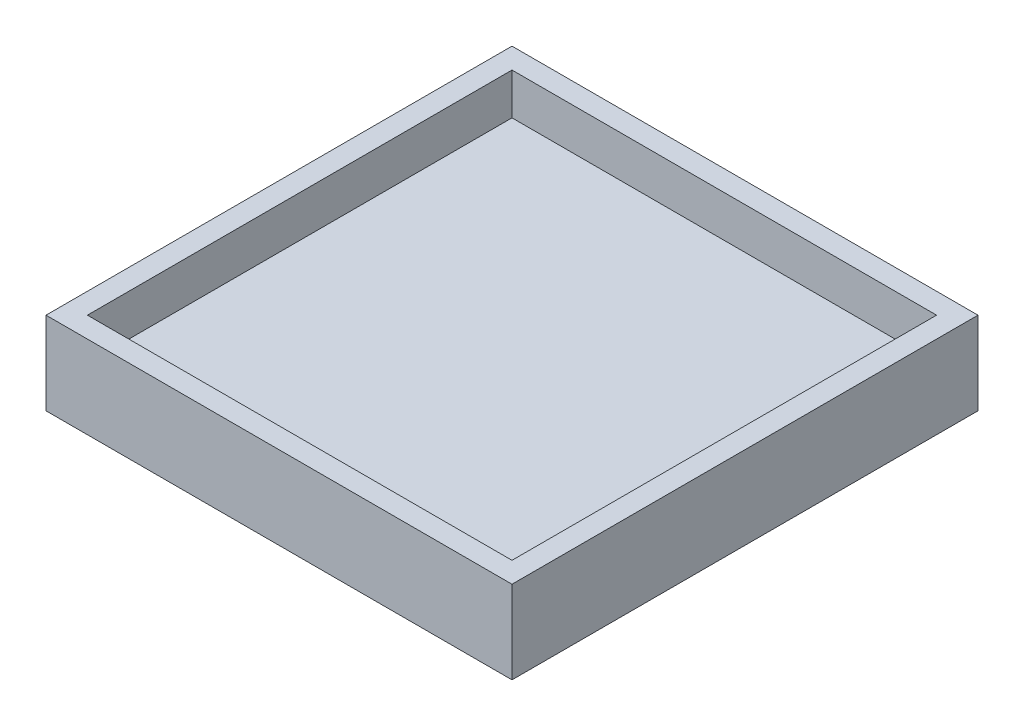
ISO-10303-21;
HEADER;
FILE_DESCRIPTION(('STEP AP214'),'2;1');
FILE_NAME('part.step','',(''),(''),'','','');
FILE_SCHEMA(('AUTOMOTIVE_DESIGN { 1 0 10303 214 1 1 1 1 }'));
ENDSEC;
DATA;
#1=APPLICATION_CONTEXT('core data for automotive mechanical design processes');
#2=APPLICATION_PROTOCOL_DEFINITION('international standard','automotive_design',2000,#1);
#3=PRODUCT_CONTEXT('',#1,'mechanical');
#4=PRODUCT('Part','Part','',(#3));
#5=PRODUCT_RELATED_PRODUCT_CATEGORY('part','',(#4));
#6=PRODUCT_DEFINITION_FORMATION('','',#4);
#7=PRODUCT_DEFINITION_CONTEXT('part definition',#1,'design');
#8=PRODUCT_DEFINITION('design','',#6,#7);
#9=PRODUCT_DEFINITION_SHAPE('','',#8);
#10=(LENGTH_UNIT() NAMED_UNIT(*) SI_UNIT(.MILLI.,.METRE.));
#11=(NAMED_UNIT(*) PLANE_ANGLE_UNIT() SI_UNIT($,.RADIAN.));
#12=(NAMED_UNIT(*) SI_UNIT($,.STERADIAN.) SOLID_ANGLE_UNIT());
#13=UNCERTAINTY_MEASURE_WITH_UNIT(LENGTH_MEASURE(1.E-05),#10,'distance_accuracy_value','');
#14=(GEOMETRIC_REPRESENTATION_CONTEXT(3) GLOBAL_UNCERTAINTY_ASSIGNED_CONTEXT((#13)) GLOBAL_UNIT_ASSIGNED_CONTEXT((#10,
#11,#12)) REPRESENTATION_CONTEXT('',''));
#15=CARTESIAN_POINT('',(0.,0.,0.));
#16=DIRECTION('',(0.,0.,1.));
#17=DIRECTION('',(1.,0.,0.));
#18=AXIS2_PLACEMENT_3D('',#15,#16,#17);
#19=CARTESIAN_POINT('',(0.,40.,-100.));
#20=DIRECTION('',(0.,0.,1.));
#21=DIRECTION('',(1.,0.,0.));
#22=AXIS2_PLACEMENT_3D('',#19,#20,#21);
#23=PLANE('',#22);
#24=DIRECTION('',(-1.,0.,0.));
#25=VECTOR('',#24,1.);
#26=CARTESIAN_POINT('',(0.,0.,-100.));
#27=LINE('',#26,#25);
#28=CARTESIAN_POINT('',(92.,0.,-100.));
#29=VERTEX_POINT('',#28);
#30=CARTESIAN_POINT('',(-133.,0.,-100.));
#31=VERTEX_POINT('',#30);
#32=EDGE_CURVE('E137',#29,#31,#27,.T.);
#33=ORIENTED_EDGE('',*,*,#32,.T.);
#34=DIRECTION('',(0.,-1.,0.));
#35=VECTOR('',#34,1.);
#36=CARTESIAN_POINT('',(-133.,40.,-100.));
#37=LINE('',#36,#35);
#38=CARTESIAN_POINT('',(-133.,40.,-100.));
#39=VERTEX_POINT('',#38);
#40=EDGE_CURVE('E11',#39,#31,#37,.T.);
#41=ORIENTED_EDGE('',*,*,#40,.F.);
#42=DIRECTION('',(-1.,0.,0.));
#43=VECTOR('',#42,1.);
#44=CARTESIAN_POINT('',(0.,40.,-100.));
#45=LINE('',#44,#43);
#46=CARTESIAN_POINT('',(92.,40.,-100.));
#47=VERTEX_POINT('',#46);
#48=EDGE_CURVE('E118',#47,#39,#45,.T.);
#49=ORIENTED_EDGE('',*,*,#48,.F.);
#50=DIRECTION('',(0.,-1.,0.));
#51=VECTOR('',#50,1.);
#52=CARTESIAN_POINT('',(92.,40.,-100.));
#53=LINE('',#52,#51);
#54=EDGE_CURVE('E67',#47,#29,#53,.T.);
#55=ORIENTED_EDGE('',*,*,#54,.T.);
#56=EDGE_LOOP('',(#33,#41,#49,#55));
#57=FACE_BOUND('',#56,.T.);
#58=ADVANCED_FACE('F41',(#57),#23,.F.);
#59=CARTESIAN_POINT('',(-133.,40.,0.));
#60=DIRECTION('',(1.,0.,0.));
#61=DIRECTION('',(0.,0.,-1.));
#62=AXIS2_PLACEMENT_3D('',#59,#60,#61);
#63=PLANE('',#62);
#64=DIRECTION('',(0.,0.,1.));
#65=VECTOR('',#64,1.);
#66=CARTESIAN_POINT('',(-133.,0.,0.));
#67=LINE('',#66,#65);
#68=CARTESIAN_POINT('',(-133.,0.,125.));
#69=VERTEX_POINT('',#68);
#70=EDGE_CURVE('E124',#31,#69,#67,.T.);
#71=ORIENTED_EDGE('',*,*,#70,.T.);
#72=DIRECTION('',(0.,-1.,0.));
#73=VECTOR('',#72,1.);
#74=CARTESIAN_POINT('',(-133.,40.,125.));
#75=LINE('',#74,#73);
#76=CARTESIAN_POINT('',(-133.,40.,125.));
#77=VERTEX_POINT('',#76);
#78=EDGE_CURVE('E50',#77,#69,#75,.T.);
#79=ORIENTED_EDGE('',*,*,#78,.F.);
#80=DIRECTION('',(0.,0.,1.));
#81=VECTOR('',#80,1.);
#82=CARTESIAN_POINT('',(-133.,40.,0.));
#83=LINE('',#82,#81);
#84=EDGE_CURVE('E112',#39,#77,#83,.T.);
#85=ORIENTED_EDGE('',*,*,#84,.F.);
#86=ORIENTED_EDGE('',*,*,#40,.T.);
#87=EDGE_LOOP('',(#71,#79,#85,#86));
#88=FACE_BOUND('',#87,.T.);
#89=ADVANCED_FACE('F123',(#88),#63,.F.);
#90=CARTESIAN_POINT('',(0.,40.,125.));
#91=DIRECTION('',(0.,0.,1.));
#92=DIRECTION('',(1.,0.,0.));
#93=AXIS2_PLACEMENT_3D('',#90,#91,#92);
#94=PLANE('',#93);
#95=DIRECTION('',(-1.,0.,0.));
#96=VECTOR('',#95,1.);
#97=CARTESIAN_POINT('',(0.,0.,125.));
#98=LINE('',#97,#96);
#99=CARTESIAN_POINT('',(92.,0.,125.));
#100=VERTEX_POINT('',#99);
#101=EDGE_CURVE('E141',#100,#69,#98,.T.);
#102=ORIENTED_EDGE('',*,*,#101,.F.);
#103=DIRECTION('',(0.,-1.,0.));
#104=VECTOR('',#103,1.);
#105=CARTESIAN_POINT('',(92.,40.,125.));
#106=LINE('',#105,#104);
#107=CARTESIAN_POINT('',(92.,40.,125.));
#108=VERTEX_POINT('',#107);
#109=EDGE_CURVE('E128',#108,#100,#106,.T.);
#110=ORIENTED_EDGE('',*,*,#109,.F.);
#111=DIRECTION('',(-1.,0.,0.));
#112=VECTOR('',#111,1.);
#113=CARTESIAN_POINT('',(0.,40.,125.));
#114=LINE('',#113,#112);
#115=EDGE_CURVE('E117',#108,#77,#114,.T.);
#116=ORIENTED_EDGE('',*,*,#115,.T.);
#117=ORIENTED_EDGE('',*,*,#78,.T.);
#118=EDGE_LOOP('',(#102,#110,#116,#117));
#119=FACE_BOUND('',#118,.T.);
#120=ADVANCED_FACE('F130',(#119),#94,.T.);
#121=CARTESIAN_POINT('',(-123.,40.,0.));
#122=DIRECTION('',(1.,0.,0.));
#123=DIRECTION('',(0.,0.,-1.));
#124=AXIS2_PLACEMENT_3D('',#121,#122,#123);
#125=PLANE('',#124);
#126=DIRECTION('',(0.,0.,1.));
#127=VECTOR('',#126,1.);
#128=CARTESIAN_POINT('',(-123.,20.,0.));
#129=LINE('',#128,#127);
#130=CARTESIAN_POINT('',(-123.,20.,-90.));
#131=VERTEX_POINT('',#130);
#132=CARTESIAN_POINT('',(-123.,20.,115.));
#133=VERTEX_POINT('',#132);
#134=EDGE_CURVE('E58',#131,#133,#129,.T.);
#135=ORIENTED_EDGE('',*,*,#134,.F.);
#136=DIRECTION('',(0.,-1.,0.));
#137=VECTOR('',#136,1.);
#138=CARTESIAN_POINT('',(-123.,40.,-90.));
#139=LINE('',#138,#137);
#140=CARTESIAN_POINT('',(-123.,40.,-90.));
#141=VERTEX_POINT('',#140);
#142=EDGE_CURVE('E45',#141,#131,#139,.T.);
#143=ORIENTED_EDGE('',*,*,#142,.F.);
#144=DIRECTION('',(0.,0.,1.));
#145=VECTOR('',#144,1.);
#146=CARTESIAN_POINT('',(-123.,40.,0.));
#147=LINE('',#146,#145);
#148=CARTESIAN_POINT('',(-123.,40.,115.));
#149=VERTEX_POINT('',#148);
#150=EDGE_CURVE('E146',#141,#149,#147,.T.);
#151=ORIENTED_EDGE('',*,*,#150,.T.);
#152=DIRECTION('',(0.,-1.,0.));
#153=VECTOR('',#152,1.);
#154=CARTESIAN_POINT('',(-123.,40.,115.));
#155=LINE('',#154,#153);
#156=EDGE_CURVE('E133',#149,#133,#155,.T.);
#157=ORIENTED_EDGE('',*,*,#156,.T.);
#158=EDGE_LOOP('',(#135,#143,#151,#157));
#159=FACE_BOUND('',#158,.T.);
#160=ADVANCED_FACE('F43',(#159),#125,.T.);
#161=CARTESIAN_POINT('',(0.,40.,-90.));
#162=DIRECTION('',(0.,0.,1.));
#163=DIRECTION('',(1.,0.,0.));
#164=AXIS2_PLACEMENT_3D('',#161,#162,#163);
#165=PLANE('',#164);
#166=DIRECTION('',(-1.,0.,0.));
#167=VECTOR('',#166,1.);
#168=CARTESIAN_POINT('',(0.,20.,-90.));
#169=LINE('',#168,#167);
#170=CARTESIAN_POINT('',(82.,20.,-90.));
#171=VERTEX_POINT('',#170);
#172=EDGE_CURVE('E163',#171,#131,#169,.T.);
#173=ORIENTED_EDGE('',*,*,#172,.F.);
#174=DIRECTION('',(0.,-1.,0.));
#175=VECTOR('',#174,1.);
#176=CARTESIAN_POINT('',(82.,40.,-90.));
#177=LINE('',#176,#175);
#178=CARTESIAN_POINT('',(82.,40.,-90.));
#179=VERTEX_POINT('',#178);
#180=EDGE_CURVE('E153',#179,#171,#177,.T.);
#181=ORIENTED_EDGE('',*,*,#180,.F.);
#182=DIRECTION('',(-1.,0.,0.));
#183=VECTOR('',#182,1.);
#184=CARTESIAN_POINT('',(0.,40.,-90.));
#185=LINE('',#184,#183);
#186=EDGE_CURVE('E165',#179,#141,#185,.T.);
#187=ORIENTED_EDGE('',*,*,#186,.T.);
#188=ORIENTED_EDGE('',*,*,#142,.T.);
#189=EDGE_LOOP('',(#173,#181,#187,#188));
#190=FACE_BOUND('',#189,.T.);
#191=ADVANCED_FACE('F162',(#190),#165,.T.);
#192=CARTESIAN_POINT('',(82.,40.,0.));
#193=DIRECTION('',(1.,0.,0.));
#194=DIRECTION('',(0.,0.,-1.));
#195=AXIS2_PLACEMENT_3D('',#192,#193,#194);
#196=PLANE('',#195);
#197=ORIENTED_EDGE('',*,*,#180,.T.);
#198=DIRECTION('',(0.,0.,1.));
#199=VECTOR('',#198,1.);
#200=CARTESIAN_POINT('',(82.,20.,0.));
#201=LINE('',#200,#199);
#202=CARTESIAN_POINT('',(82.,20.,115.));
#203=VERTEX_POINT('',#202);
#204=EDGE_CURVE('E139',#171,#203,#201,.T.);
#205=ORIENTED_EDGE('',*,*,#204,.T.);
#206=DIRECTION('',(0.,-1.,0.));
#207=VECTOR('',#206,1.);
#208=CARTESIAN_POINT('',(82.,40.,115.));
#209=LINE('',#208,#207);
#210=CARTESIAN_POINT('',(82.,40.,115.));
#211=VERTEX_POINT('',#210);
#212=EDGE_CURVE('E151',#211,#203,#209,.T.);
#213=ORIENTED_EDGE('',*,*,#212,.F.);
#214=DIRECTION('',(0.,0.,1.));
#215=VECTOR('',#214,1.);
#216=CARTESIAN_POINT('',(82.,40.,0.));
#217=LINE('',#216,#215);
#218=EDGE_CURVE('E178',#179,#211,#217,.T.);
#219=ORIENTED_EDGE('',*,*,#218,.F.);
#220=EDGE_LOOP('',(#197,#205,#213,#219));
#221=FACE_BOUND('',#220,.T.);
#222=ADVANCED_FACE('F191',(#221),#196,.F.);
#223=CARTESIAN_POINT('',(0.,40.,115.));
#224=DIRECTION('',(0.,0.,1.));
#225=DIRECTION('',(1.,0.,0.));
#226=AXIS2_PLACEMENT_3D('',#223,#224,#225);
#227=PLANE('',#226);
#228=ORIENTED_EDGE('',*,*,#212,.T.);
#229=DIRECTION('',(-1.,0.,0.));
#230=VECTOR('',#229,1.);
#231=CARTESIAN_POINT('',(0.,20.,115.));
#232=LINE('',#231,#230);
#233=EDGE_CURVE('E169',#203,#133,#232,.T.);
#234=ORIENTED_EDGE('',*,*,#233,.T.);
#235=ORIENTED_EDGE('',*,*,#156,.F.);
#236=DIRECTION('',(-1.,0.,0.));
#237=VECTOR('',#236,1.);
#238=CARTESIAN_POINT('',(0.,40.,115.));
#239=LINE('',#238,#237);
#240=EDGE_CURVE('E180',#211,#149,#239,.T.);
#241=ORIENTED_EDGE('',*,*,#240,.F.);
#242=EDGE_LOOP('',(#228,#234,#235,#241));
#243=FACE_BOUND('',#242,.T.);
#244=ADVANCED_FACE('F185',(#243),#227,.F.);
#245=CARTESIAN_POINT('',(92.,40.,0.));
#246=DIRECTION('',(1.,0.,0.));
#247=DIRECTION('',(0.,0.,-1.));
#248=AXIS2_PLACEMENT_3D('',#245,#246,#247);
#249=PLANE('',#248);
#250=DIRECTION('',(0.,0.,1.));
#251=VECTOR('',#250,1.);
#252=CARTESIAN_POINT('',(92.,0.,0.));
#253=LINE('',#252,#251);
#254=EDGE_CURVE('E143',#29,#100,#253,.T.);
#255=ORIENTED_EDGE('',*,*,#254,.F.);
#256=ORIENTED_EDGE('',*,*,#54,.F.);
#257=DIRECTION('',(0.,0.,1.));
#258=VECTOR('',#257,1.);
#259=CARTESIAN_POINT('',(92.,40.,0.));
#260=LINE('',#259,#258);
#261=EDGE_CURVE('E131',#47,#108,#260,.T.);
#262=ORIENTED_EDGE('',*,*,#261,.T.);
#263=ORIENTED_EDGE('',*,*,#109,.T.);
#264=EDGE_LOOP('',(#255,#256,#262,#263));
#265=FACE_BOUND('',#264,.T.);
#266=ADVANCED_FACE('F202',(#265),#249,.T.);
#267=CARTESIAN_POINT('',(0.,40.,0.));
#268=DIRECTION('',(0.,1.,0.));
#269=DIRECTION('',(0.,0.,1.));
#270=AXIS2_PLACEMENT_3D('',#267,#268,#269);
#271=PLANE('',#270);
#272=ORIENTED_EDGE('',*,*,#150,.F.);
#273=ORIENTED_EDGE('',*,*,#186,.F.);
#274=ORIENTED_EDGE('',*,*,#218,.T.);
#275=ORIENTED_EDGE('',*,*,#240,.T.);
#276=EDGE_LOOP('',(#272,#273,#274,#275));
#277=FACE_BOUND('',#276,.T.);
#278=ORIENTED_EDGE('',*,*,#48,.T.);
#279=ORIENTED_EDGE('',*,*,#84,.T.);
#280=ORIENTED_EDGE('',*,*,#115,.F.);
#281=ORIENTED_EDGE('',*,*,#261,.F.);
#282=EDGE_LOOP('',(#278,#279,#280,#281));
#283=FACE_BOUND('',#282,.T.);
#284=ADVANCED_FACE('F114',(#277,#283),#271,.T.);
#285=CARTESIAN_POINT('',(0.,0.,0.));
#286=DIRECTION('',(0.,1.,0.));
#287=DIRECTION('',(0.,0.,1.));
#288=AXIS2_PLACEMENT_3D('',#285,#286,#287);
#289=PLANE('',#288);
#290=ORIENTED_EDGE('',*,*,#32,.F.);
#291=ORIENTED_EDGE('',*,*,#254,.T.);
#292=ORIENTED_EDGE('',*,*,#101,.T.);
#293=ORIENTED_EDGE('',*,*,#70,.F.);
#294=EDGE_LOOP('',(#290,#291,#292,#293));
#295=FACE_BOUND('',#294,.T.);
#296=ADVANCED_FACE('F226',(#295),#289,.F.);
#297=CARTESIAN_POINT('',(0.,20.,0.));
#298=DIRECTION('',(0.,1.,0.));
#299=DIRECTION('',(0.,0.,1.));
#300=AXIS2_PLACEMENT_3D('',#297,#298,#299);
#301=PLANE('',#300);
#302=ORIENTED_EDGE('',*,*,#172,.T.);
#303=ORIENTED_EDGE('',*,*,#134,.T.);
#304=ORIENTED_EDGE('',*,*,#233,.F.);
#305=ORIENTED_EDGE('',*,*,#204,.F.);
#306=EDGE_LOOP('',(#302,#303,#304,#305));
#307=FACE_BOUND('',#306,.T.);
#308=ADVANCED_FACE('F170',(#307),#301,.T.);
#309=CLOSED_SHELL('',(#58,#89,#120,#160,#191,#222,#244,#266,#284,#296,#308));
#310=MANIFOLD_SOLID_BREP('B2',#309);
#311=ADVANCED_BREP_SHAPE_REPRESENTATION('',(#18,#310),#14);
#312=SHAPE_DEFINITION_REPRESENTATION(#9,#311);
ENDSEC;
END-ISO-10303-21;
